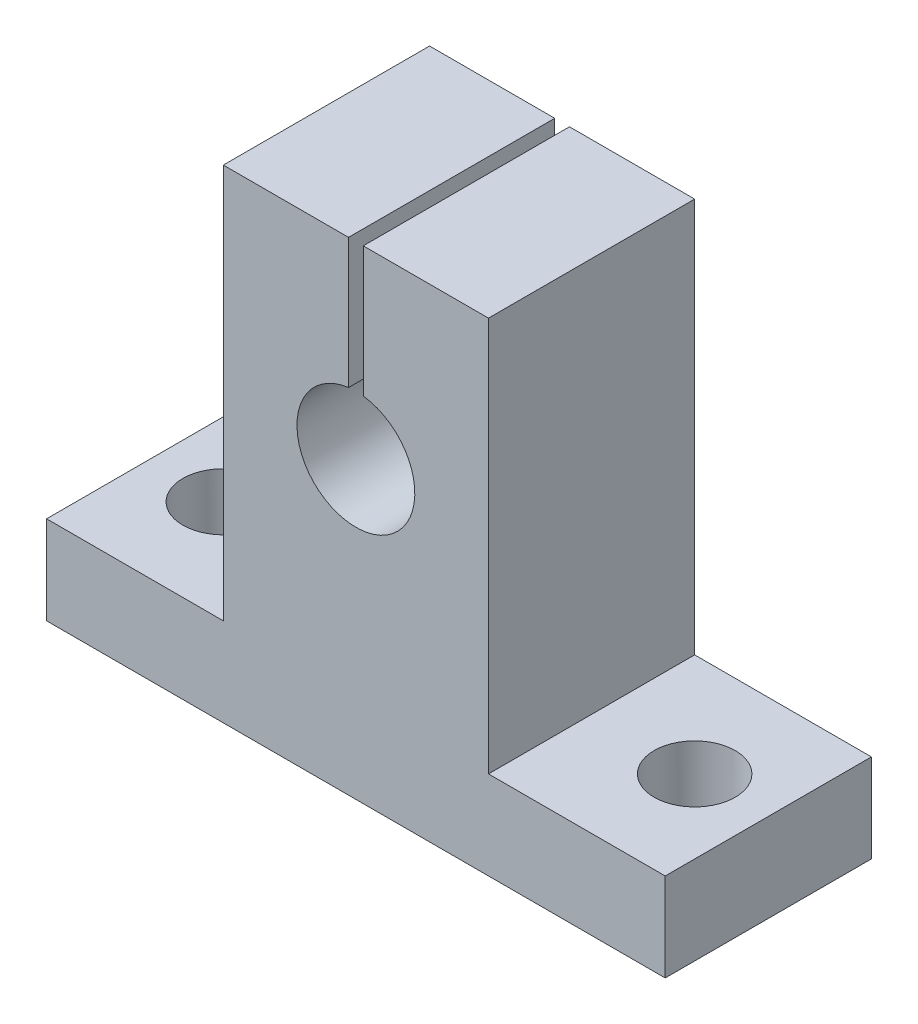
ISO-10303-21;
HEADER;
FILE_DESCRIPTION(('STEP AP214'),'2;1');
FILE_NAME('part.step','',(''),(''),'','','');
FILE_SCHEMA(('AUTOMOTIVE_DESIGN { 1 0 10303 214 1 1 1 1 }'));
ENDSEC;
DATA;
#1=APPLICATION_CONTEXT('core data for automotive mechanical design processes');
#2=APPLICATION_PROTOCOL_DEFINITION('international standard','automotive_design',2000,#1);
#3=PRODUCT_CONTEXT('',#1,'mechanical');
#4=PRODUCT('Part','Part','',(#3));
#5=PRODUCT_RELATED_PRODUCT_CATEGORY('part','',(#4));
#6=PRODUCT_DEFINITION_FORMATION('','',#4);
#7=PRODUCT_DEFINITION_CONTEXT('part definition',#1,'design');
#8=PRODUCT_DEFINITION('design','',#6,#7);
#9=PRODUCT_DEFINITION_SHAPE('','',#8);
#10=(LENGTH_UNIT() NAMED_UNIT(*) SI_UNIT(.MILLI.,.METRE.));
#11=(NAMED_UNIT(*) PLANE_ANGLE_UNIT() SI_UNIT($,.RADIAN.));
#12=(NAMED_UNIT(*) SI_UNIT($,.STERADIAN.) SOLID_ANGLE_UNIT());
#13=UNCERTAINTY_MEASURE_WITH_UNIT(LENGTH_MEASURE(1.E-05),#10,'distance_accuracy_value','');
#14=(GEOMETRIC_REPRESENTATION_CONTEXT(3) GLOBAL_UNCERTAINTY_ASSIGNED_CONTEXT((#13)) GLOBAL_UNIT_ASSIGNED_CONTEXT((#10,
#11,#12)) REPRESENTATION_CONTEXT('',''));
#15=CARTESIAN_POINT('',(0.,0.,0.));
#16=DIRECTION('',(0.,0.,1.));
#17=DIRECTION('',(1.,0.,0.));
#18=AXIS2_PLACEMENT_3D('',#15,#16,#17);
#19=CARTESIAN_POINT('',(9.,12.8,-7.));
#20=DIRECTION('',(0.,1.,0.));
#21=DIRECTION('',(0.,0.,1.));
#22=AXIS2_PLACEMENT_3D('',#19,#20,#21);
#23=PLANE('',#22);
#24=DIRECTION('',(0.,0.,1.));
#25=VECTOR('',#24,1.);
#26=CARTESIAN_POINT('',(-0.5,12.8,-7.));
#27=LINE('',#26,#25);
#28=CARTESIAN_POINT('',(-0.5,12.8,-7.));
#29=VERTEX_POINT('',#28);
#30=CARTESIAN_POINT('',(-0.5,12.8,7.));
#31=VERTEX_POINT('',#30);
#32=EDGE_CURVE('E42',#29,#31,#27,.T.);
#33=ORIENTED_EDGE('',*,*,#32,.F.);
#34=DIRECTION('',(-1.,0.,0.));
#35=VECTOR('',#34,1.);
#36=CARTESIAN_POINT('',(9.,12.8,-7.));
#37=LINE('',#36,#35);
#38=CARTESIAN_POINT('',(-9.,12.8,-7.));
#39=VERTEX_POINT('',#38);
#40=EDGE_CURVE('E161',#29,#39,#37,.T.);
#41=ORIENTED_EDGE('',*,*,#40,.T.);
#42=DIRECTION('',(0.,0.,1.));
#43=VECTOR('',#42,1.);
#44=CARTESIAN_POINT('',(-9.,12.8,-7.));
#45=LINE('',#44,#43);
#46=CARTESIAN_POINT('',(-9.,12.8,7.));
#47=VERTEX_POINT('',#46);
#48=EDGE_CURVE('E188',#39,#47,#45,.T.);
#49=ORIENTED_EDGE('',*,*,#48,.T.);
#50=DIRECTION('',(-1.,0.,0.));
#51=VECTOR('',#50,1.);
#52=CARTESIAN_POINT('',(9.,12.8,7.));
#53=LINE('',#52,#51);
#54=EDGE_CURVE('E136',#31,#47,#53,.T.);
#55=ORIENTED_EDGE('',*,*,#54,.F.);
#56=EDGE_LOOP('',(#33,#41,#49,#55));
#57=FACE_BOUND('',#56,.T.);
#58=ADVANCED_FACE('F17',(#57),#23,.T.);
#59=CARTESIAN_POINT('',(9.,-14.,-7.));
#60=DIRECTION('',(0.,1.,0.));
#61=DIRECTION('',(-1.,0.,0.));
#62=AXIS2_PLACEMENT_3D('',#59,#60,#61);
#63=PLANE('',#62);
#64=CARTESIAN_POINT('',(16.,-14.,0.));
#65=DIRECTION('',(0.,1.,0.));
#66=DIRECTION('',(-1.,0.,0.));
#67=AXIS2_PLACEMENT_3D('',#64,#65,#66);
#68=CIRCLE('',#67,2.75);
#69=CARTESIAN_POINT('',(13.25,-14.,0.));
#70=VERTEX_POINT('',#69);
#71=EDGE_CURVE('E222',#70,#70,#68,.T.);
#72=ORIENTED_EDGE('',*,*,#71,.F.);
#73=EDGE_LOOP('',(#72));
#74=FACE_BOUND('',#73,.T.);
#75=DIRECTION('',(0.,0.,1.));
#76=VECTOR('',#75,1.);
#77=CARTESIAN_POINT('',(9.,-14.,-7.));
#78=LINE('',#77,#76);
#79=CARTESIAN_POINT('',(9.,-14.,-7.));
#80=VERTEX_POINT('',#79);
#81=CARTESIAN_POINT('',(9.,-14.,7.));
#82=VERTEX_POINT('',#81);
#83=EDGE_CURVE('E179',#80,#82,#78,.T.);
#84=ORIENTED_EDGE('',*,*,#83,.T.);
#85=DIRECTION('',(-1.,0.,0.));
#86=VECTOR('',#85,1.);
#87=CARTESIAN_POINT('',(9.,-14.,7.));
#88=LINE('',#87,#86);
#89=CARTESIAN_POINT('',(21.,-14.,7.));
#90=VERTEX_POINT('',#89);
#91=EDGE_CURVE('E125',#90,#82,#88,.T.);
#92=ORIENTED_EDGE('',*,*,#91,.F.);
#93=DIRECTION('',(0.,0.,1.));
#94=VECTOR('',#93,1.);
#95=CARTESIAN_POINT('',(21.,-14.,-7.));
#96=LINE('',#95,#94);
#97=CARTESIAN_POINT('',(21.,-14.,-7.));
#98=VERTEX_POINT('',#97);
#99=EDGE_CURVE('E11',#98,#90,#96,.T.);
#100=ORIENTED_EDGE('',*,*,#99,.F.);
#101=DIRECTION('',(-1.,0.,0.));
#102=VECTOR('',#101,1.);
#103=CARTESIAN_POINT('',(9.,-14.,-7.));
#104=LINE('',#103,#102);
#105=EDGE_CURVE('E155',#98,#80,#104,.T.);
#106=ORIENTED_EDGE('',*,*,#105,.T.);
#107=EDGE_LOOP('',(#84,#92,#100,#106));
#108=FACE_BOUND('',#107,.T.);
#109=ADVANCED_FACE('F19',(#74,#108),#63,.T.);
#110=CARTESIAN_POINT('',(21.,-14.,-7.));
#111=DIRECTION('',(1.,0.,0.));
#112=DIRECTION('',(0.,0.,-1.));
#113=AXIS2_PLACEMENT_3D('',#110,#111,#112);
#114=PLANE('',#113);
#115=ORIENTED_EDGE('',*,*,#99,.T.);
#116=DIRECTION('',(0.,1.,0.));
#117=VECTOR('',#116,1.);
#118=CARTESIAN_POINT('',(21.,-14.,7.));
#119=LINE('',#118,#117);
#120=CARTESIAN_POINT('',(21.,-20.,7.));
#121=VERTEX_POINT('',#120);
#122=EDGE_CURVE('E151',#121,#90,#119,.T.);
#123=ORIENTED_EDGE('',*,*,#122,.F.);
#124=DIRECTION('',(0.,0.,1.));
#125=VECTOR('',#124,1.);
#126=CARTESIAN_POINT('',(21.,-20.,-7.));
#127=LINE('',#126,#125);
#128=CARTESIAN_POINT('',(21.,-20.,-7.));
#129=VERTEX_POINT('',#128);
#130=EDGE_CURVE('E26',#129,#121,#127,.T.);
#131=ORIENTED_EDGE('',*,*,#130,.F.);
#132=DIRECTION('',(0.,1.,0.));
#133=VECTOR('',#132,1.);
#134=CARTESIAN_POINT('',(21.,-14.,-7.));
#135=LINE('',#134,#133);
#136=EDGE_CURVE('E177',#129,#98,#135,.T.);
#137=ORIENTED_EDGE('',*,*,#136,.T.);
#138=EDGE_LOOP('',(#115,#123,#131,#137));
#139=FACE_BOUND('',#138,.T.);
#140=ADVANCED_FACE('F203',(#139),#114,.T.);
#141=CARTESIAN_POINT('',(-21.,-20.,-7.));
#142=DIRECTION('',(0.,-1.,0.));
#143=DIRECTION('',(0.,0.,-1.));
#144=AXIS2_PLACEMENT_3D('',#141,#142,#143);
#145=PLANE('',#144);
#146=CARTESIAN_POINT('',(16.,-20.,0.));
#147=DIRECTION('',(0.,1.,0.));
#148=DIRECTION('',(0.,0.,1.));
#149=AXIS2_PLACEMENT_3D('',#146,#147,#148);
#150=CIRCLE('',#149,2.75);
#151=CARTESIAN_POINT('',(16.,-20.,2.75));
#152=VERTEX_POINT('',#151);
#153=EDGE_CURVE('E225',#152,#152,#150,.T.);
#154=ORIENTED_EDGE('',*,*,#153,.T.);
#155=EDGE_LOOP('',(#154));
#156=FACE_BOUND('',#155,.T.);
#157=CARTESIAN_POINT('',(-16.,-20.,0.));
#158=DIRECTION('',(0.,1.,0.));
#159=DIRECTION('',(0.,0.,1.));
#160=AXIS2_PLACEMENT_3D('',#157,#158,#159);
#161=CIRCLE('',#160,2.75);
#162=CARTESIAN_POINT('',(-16.,-20.,2.75));
#163=VERTEX_POINT('',#162);
#164=EDGE_CURVE('E219',#163,#163,#161,.T.);
#165=ORIENTED_EDGE('',*,*,#164,.T.);
#166=EDGE_LOOP('',(#165));
#167=FACE_BOUND('',#166,.T.);
#168=ORIENTED_EDGE('',*,*,#130,.T.);
#169=DIRECTION('',(1.,0.,0.));
#170=VECTOR('',#169,1.);
#171=CARTESIAN_POINT('',(-21.,-20.,7.));
#172=LINE('',#171,#170);
#173=CARTESIAN_POINT('',(-21.,-20.,7.));
#174=VERTEX_POINT('',#173);
#175=EDGE_CURVE('E148',#174,#121,#172,.T.);
#176=ORIENTED_EDGE('',*,*,#175,.F.);
#177=DIRECTION('',(0.,0.,1.));
#178=VECTOR('',#177,1.);
#179=CARTESIAN_POINT('',(-21.,-20.,-7.));
#180=LINE('',#179,#178);
#181=CARTESIAN_POINT('',(-21.,-20.,-7.));
#182=VERTEX_POINT('',#181);
#183=EDGE_CURVE('E182',#182,#174,#180,.T.);
#184=ORIENTED_EDGE('',*,*,#183,.F.);
#185=DIRECTION('',(1.,0.,0.));
#186=VECTOR('',#185,1.);
#187=CARTESIAN_POINT('',(-21.,-20.,-7.));
#188=LINE('',#187,#186);
#189=EDGE_CURVE('E174',#182,#129,#188,.T.);
#190=ORIENTED_EDGE('',*,*,#189,.T.);
#191=EDGE_LOOP('',(#168,#176,#184,#190));
#192=FACE_BOUND('',#191,.T.);
#193=ADVANCED_FACE('F229',(#156,#167,#192),#145,.T.);
#194=CARTESIAN_POINT('',(-21.,-14.,-7.));
#195=DIRECTION('',(-1.,0.,0.));
#196=DIRECTION('',(0.,0.,1.));
#197=AXIS2_PLACEMENT_3D('',#194,#195,#196);
#198=PLANE('',#197);
#199=ORIENTED_EDGE('',*,*,#183,.T.);
#200=DIRECTION('',(0.,-1.,0.));
#201=VECTOR('',#200,1.);
#202=CARTESIAN_POINT('',(-21.,-14.,7.));
#203=LINE('',#202,#201);
#204=CARTESIAN_POINT('',(-21.,-14.,7.));
#205=VERTEX_POINT('',#204);
#206=EDGE_CURVE('E145',#205,#174,#203,.T.);
#207=ORIENTED_EDGE('',*,*,#206,.F.);
#208=DIRECTION('',(0.,0.,1.));
#209=VECTOR('',#208,1.);
#210=CARTESIAN_POINT('',(-21.,-14.,-7.));
#211=LINE('',#210,#209);
#212=CARTESIAN_POINT('',(-21.,-14.,-7.));
#213=VERTEX_POINT('',#212);
#214=EDGE_CURVE('E184',#213,#205,#211,.T.);
#215=ORIENTED_EDGE('',*,*,#214,.F.);
#216=DIRECTION('',(0.,-1.,0.));
#217=VECTOR('',#216,1.);
#218=CARTESIAN_POINT('',(-21.,-14.,-7.));
#219=LINE('',#218,#217);
#220=EDGE_CURVE('E171',#213,#182,#219,.T.);
#221=ORIENTED_EDGE('',*,*,#220,.T.);
#222=EDGE_LOOP('',(#199,#207,#215,#221));
#223=FACE_BOUND('',#222,.T.);
#224=ADVANCED_FACE('F266',(#223),#198,.T.);
#225=CARTESIAN_POINT('',(-9.,-14.,-7.));
#226=DIRECTION('',(0.,1.,0.));
#227=DIRECTION('',(-1.,0.,0.));
#228=AXIS2_PLACEMENT_3D('',#225,#226,#227);
#229=PLANE('',#228);
#230=CARTESIAN_POINT('',(-16.,-14.,0.));
#231=DIRECTION('',(0.,1.,0.));
#232=DIRECTION('',(-1.,0.,0.));
#233=AXIS2_PLACEMENT_3D('',#230,#231,#232);
#234=CIRCLE('',#233,2.75);
#235=CARTESIAN_POINT('',(-18.75,-14.,0.));
#236=VERTEX_POINT('',#235);
#237=EDGE_CURVE('E21',#236,#236,#234,.T.);
#238=ORIENTED_EDGE('',*,*,#237,.F.);
#239=EDGE_LOOP('',(#238));
#240=FACE_BOUND('',#239,.T.);
#241=ORIENTED_EDGE('',*,*,#214,.T.);
#242=DIRECTION('',(-1.,0.,0.));
#243=VECTOR('',#242,1.);
#244=CARTESIAN_POINT('',(-9.,-14.,7.));
#245=LINE('',#244,#243);
#246=CARTESIAN_POINT('',(-9.,-14.,7.));
#247=VERTEX_POINT('',#246);
#248=EDGE_CURVE('E142',#247,#205,#245,.T.);
#249=ORIENTED_EDGE('',*,*,#248,.F.);
#250=DIRECTION('',(0.,0.,1.));
#251=VECTOR('',#250,1.);
#252=CARTESIAN_POINT('',(-9.,-14.,-7.));
#253=LINE('',#252,#251);
#254=CARTESIAN_POINT('',(-9.,-14.,-7.));
#255=VERTEX_POINT('',#254);
#256=EDGE_CURVE('E186',#255,#247,#253,.T.);
#257=ORIENTED_EDGE('',*,*,#256,.F.);
#258=DIRECTION('',(-1.,0.,0.));
#259=VECTOR('',#258,1.);
#260=CARTESIAN_POINT('',(-9.,-14.,-7.));
#261=LINE('',#260,#259);
#262=EDGE_CURVE('E168',#255,#213,#261,.T.);
#263=ORIENTED_EDGE('',*,*,#262,.T.);
#264=EDGE_LOOP('',(#241,#249,#257,#263));
#265=FACE_BOUND('',#264,.T.);
#266=ADVANCED_FACE('F260',(#240,#265),#229,.T.);
#267=CARTESIAN_POINT('',(-9.,12.8,-7.));
#268=DIRECTION('',(-1.,0.,0.));
#269=DIRECTION('',(0.,-1.,0.));
#270=AXIS2_PLACEMENT_3D('',#267,#268,#269);
#271=PLANE('',#270);
#272=ORIENTED_EDGE('',*,*,#256,.T.);
#273=DIRECTION('',(0.,-1.,0.));
#274=VECTOR('',#273,1.);
#275=CARTESIAN_POINT('',(-9.,12.8,7.));
#276=LINE('',#275,#274);
#277=EDGE_CURVE('E139',#47,#247,#276,.T.);
#278=ORIENTED_EDGE('',*,*,#277,.F.);
#279=ORIENTED_EDGE('',*,*,#48,.F.);
#280=DIRECTION('',(0.,-1.,0.));
#281=VECTOR('',#280,1.);
#282=CARTESIAN_POINT('',(-9.,12.8,-7.));
#283=LINE('',#282,#281);
#284=EDGE_CURVE('E165',#39,#255,#283,.T.);
#285=ORIENTED_EDGE('',*,*,#284,.T.);
#286=EDGE_LOOP('',(#272,#278,#279,#285));
#287=FACE_BOUND('',#286,.T.);
#288=ADVANCED_FACE('F254',(#287),#271,.T.);
#289=DIRECTION('',(0.,0.,1.));
#290=VECTOR('',#289,1.);
#291=CARTESIAN_POINT('',(0.5,12.8,-7.));
#292=LINE('',#291,#290);
#293=CARTESIAN_POINT('',(0.5,12.8,-7.));
#294=VERTEX_POINT('',#293);
#295=CARTESIAN_POINT('',(0.5,12.8,7.));
#296=VERTEX_POINT('',#295);
#297=EDGE_CURVE('E130',#294,#296,#292,.T.);
#298=ORIENTED_EDGE('',*,*,#297,.T.);
#299=CARTESIAN_POINT('',(9.,12.8,7.));
#300=VERTEX_POINT('',#299);
#301=EDGE_CURVE('E137',#300,#296,#53,.T.);
#302=ORIENTED_EDGE('',*,*,#301,.F.);
#303=DIRECTION('',(0.,0.,1.));
#304=VECTOR('',#303,1.);
#305=CARTESIAN_POINT('',(9.,12.8,-7.));
#306=LINE('',#305,#304);
#307=CARTESIAN_POINT('',(9.,12.8,-7.));
#308=VERTEX_POINT('',#307);
#309=EDGE_CURVE('E191',#308,#300,#306,.T.);
#310=ORIENTED_EDGE('',*,*,#309,.F.);
#311=EDGE_CURVE('E162',#308,#294,#37,.T.);
#312=ORIENTED_EDGE('',*,*,#311,.T.);
#313=EDGE_LOOP('',(#298,#302,#310,#312));
#314=FACE_BOUND('',#313,.T.);
#315=ADVANCED_FACE('F212',(#314),#23,.T.);
#316=CARTESIAN_POINT('',(9.,12.8,-7.));
#317=DIRECTION('',(1.,0.,0.));
#318=DIRECTION('',(0.,1.,0.));
#319=AXIS2_PLACEMENT_3D('',#316,#317,#318);
#320=PLANE('',#319);
#321=ORIENTED_EDGE('',*,*,#309,.T.);
#322=DIRECTION('',(0.,1.,0.));
#323=VECTOR('',#322,1.);
#324=CARTESIAN_POINT('',(9.,12.8,7.));
#325=LINE('',#324,#323);
#326=EDGE_CURVE('E128',#82,#300,#325,.T.);
#327=ORIENTED_EDGE('',*,*,#326,.F.);
#328=ORIENTED_EDGE('',*,*,#83,.F.);
#329=DIRECTION('',(0.,1.,0.));
#330=VECTOR('',#329,1.);
#331=CARTESIAN_POINT('',(9.,12.8,-7.));
#332=LINE('',#331,#330);
#333=EDGE_CURVE('E158',#80,#308,#332,.T.);
#334=ORIENTED_EDGE('',*,*,#333,.T.);
#335=EDGE_LOOP('',(#321,#327,#328,#334));
#336=FACE_BOUND('',#335,.T.);
#337=ADVANCED_FACE('F198',(#336),#320,.T.);
#338=CARTESIAN_POINT('',(0.,0.,-7.));
#339=DIRECTION('',(0.,0.,-1.));
#340=DIRECTION('',(-1.,0.,0.));
#341=AXIS2_PLACEMENT_3D('',#338,#339,#340);
#342=PLANE('',#341);
#343=DIRECTION('',(0.,-1.,0.));
#344=VECTOR('',#343,1.);
#345=CARTESIAN_POINT('',(-0.5,12.8,-7.));
#346=LINE('',#345,#344);
#347=CARTESIAN_POINT('',(-0.5,3.96862696659689,-7.));
#348=VERTEX_POINT('',#347);
#349=EDGE_CURVE('E216',#29,#348,#346,.T.);
#350=ORIENTED_EDGE('',*,*,#349,.T.);
#351=CARTESIAN_POINT('',(0.,0.,-7.));
#352=DIRECTION('',(0.,0.,1.));
#353=DIRECTION('',(1.,0.,0.));
#354=AXIS2_PLACEMENT_3D('',#351,#352,#353);
#355=CIRCLE('',#354,4.);
#356=CARTESIAN_POINT('',(0.5,3.96862696659689,-7.));
#357=VERTEX_POINT('',#356);
#358=EDGE_CURVE('E120',#348,#357,#355,.T.);
#359=ORIENTED_EDGE('',*,*,#358,.T.);
#360=DIRECTION('',(0.,1.,0.));
#361=VECTOR('',#360,1.);
#362=CARTESIAN_POINT('',(0.5,12.8,-7.));
#363=LINE('',#362,#361);
#364=EDGE_CURVE('E121',#357,#294,#363,.T.);
#365=ORIENTED_EDGE('',*,*,#364,.T.);
#366=ORIENTED_EDGE('',*,*,#311,.F.);
#367=ORIENTED_EDGE('',*,*,#333,.F.);
#368=ORIENTED_EDGE('',*,*,#105,.F.);
#369=ORIENTED_EDGE('',*,*,#136,.F.);
#370=ORIENTED_EDGE('',*,*,#189,.F.);
#371=ORIENTED_EDGE('',*,*,#220,.F.);
#372=ORIENTED_EDGE('',*,*,#262,.F.);
#373=ORIENTED_EDGE('',*,*,#284,.F.);
#374=ORIENTED_EDGE('',*,*,#40,.F.);
#375=EDGE_LOOP('',(#350,#359,#365,#366,#367,#368,#369,#370,#371,#372,#373,#374));
#376=FACE_BOUND('',#375,.T.);
#377=ADVANCED_FACE('F206',(#376),#342,.T.);
#378=CARTESIAN_POINT('',(0.,0.,-7.));
#379=DIRECTION('',(0.,0.,1.));
#380=DIRECTION('',(1.,0.,0.));
#381=AXIS2_PLACEMENT_3D('',#378,#379,#380);
#382=CYLINDRICAL_SURFACE('',#381,4.);
#383=CARTESIAN_POINT('',(0.,0.,7.));
#384=DIRECTION('',(0.,0.,1.));
#385=DIRECTION('',(1.,0.,0.));
#386=AXIS2_PLACEMENT_3D('',#383,#384,#385);
#387=CIRCLE('',#386,4.);
#388=CARTESIAN_POINT('',(-0.5,3.96862696659689,7.));
#389=VERTEX_POINT('',#388);
#390=CARTESIAN_POINT('',(0.5,3.96862696659689,7.));
#391=VERTEX_POINT('',#390);
#392=EDGE_CURVE('E118',#389,#391,#387,.T.);
#393=ORIENTED_EDGE('',*,*,#392,.T.);
#394=DIRECTION('',(0.,0.,1.));
#395=VECTOR('',#394,1.);
#396=CARTESIAN_POINT('',(0.5,3.96862696659689,-7.));
#397=LINE('',#396,#395);
#398=EDGE_CURVE('E34',#357,#391,#397,.T.);
#399=ORIENTED_EDGE('',*,*,#398,.F.);
#400=ORIENTED_EDGE('',*,*,#358,.F.);
#401=DIRECTION('',(0.,0.,1.));
#402=VECTOR('',#401,1.);
#403=CARTESIAN_POINT('',(-0.5,3.96862696659689,-7.));
#404=LINE('',#403,#402);
#405=EDGE_CURVE('E107',#348,#389,#404,.T.);
#406=ORIENTED_EDGE('',*,*,#405,.T.);
#407=EDGE_LOOP('',(#393,#399,#400,#406));
#408=FACE_BOUND('',#407,.T.);
#409=ADVANCED_FACE('F117',(#408),#382,.F.);
#410=CARTESIAN_POINT('',(0.,0.,7.));
#411=DIRECTION('',(0.,0.,-1.));
#412=DIRECTION('',(-1.,0.,0.));
#413=AXIS2_PLACEMENT_3D('',#410,#411,#412);
#414=PLANE('',#413);
#415=ORIENTED_EDGE('',*,*,#392,.F.);
#416=DIRECTION('',(0.,-1.,0.));
#417=VECTOR('',#416,1.);
#418=CARTESIAN_POINT('',(-0.5,12.8,7.));
#419=LINE('',#418,#417);
#420=EDGE_CURVE('E104',#31,#389,#419,.T.);
#421=ORIENTED_EDGE('',*,*,#420,.F.);
#422=ORIENTED_EDGE('',*,*,#54,.T.);
#423=ORIENTED_EDGE('',*,*,#277,.T.);
#424=ORIENTED_EDGE('',*,*,#248,.T.);
#425=ORIENTED_EDGE('',*,*,#206,.T.);
#426=ORIENTED_EDGE('',*,*,#175,.T.);
#427=ORIENTED_EDGE('',*,*,#122,.T.);
#428=ORIENTED_EDGE('',*,*,#91,.T.);
#429=ORIENTED_EDGE('',*,*,#326,.T.);
#430=ORIENTED_EDGE('',*,*,#301,.T.);
#431=DIRECTION('',(0.,1.,0.));
#432=VECTOR('',#431,1.);
#433=CARTESIAN_POINT('',(0.5,12.8,7.));
#434=LINE('',#433,#432);
#435=EDGE_CURVE('E112',#391,#296,#434,.T.);
#436=ORIENTED_EDGE('',*,*,#435,.F.);
#437=EDGE_LOOP('',(#415,#421,#422,#423,#424,#425,#426,#427,#428,#429,#430,#436));
#438=FACE_BOUND('',#437,.T.);
#439=ADVANCED_FACE('F123',(#438),#414,.F.);
#440=CARTESIAN_POINT('',(0.5,12.8,-7.));
#441=DIRECTION('',(1.,0.,0.));
#442=DIRECTION('',(0.,1.,0.));
#443=AXIS2_PLACEMENT_3D('',#440,#441,#442);
#444=PLANE('',#443);
#445=ORIENTED_EDGE('',*,*,#297,.F.);
#446=ORIENTED_EDGE('',*,*,#364,.F.);
#447=ORIENTED_EDGE('',*,*,#398,.T.);
#448=ORIENTED_EDGE('',*,*,#435,.T.);
#449=EDGE_LOOP('',(#445,#446,#447,#448));
#450=FACE_BOUND('',#449,.T.);
#451=ADVANCED_FACE('F283',(#450),#444,.F.);
#452=CARTESIAN_POINT('',(-0.5,12.8,-7.));
#453=DIRECTION('',(-1.,0.,0.));
#454=DIRECTION('',(0.,-1.,0.));
#455=AXIS2_PLACEMENT_3D('',#452,#453,#454);
#456=PLANE('',#455);
#457=ORIENTED_EDGE('',*,*,#405,.F.);
#458=ORIENTED_EDGE('',*,*,#349,.F.);
#459=ORIENTED_EDGE('',*,*,#32,.T.);
#460=ORIENTED_EDGE('',*,*,#420,.T.);
#461=EDGE_LOOP('',(#457,#458,#459,#460));
#462=FACE_BOUND('',#461,.T.);
#463=ADVANCED_FACE('F106',(#462),#456,.F.);
#464=CARTESIAN_POINT('',(-16.,-20.,0.));
#465=DIRECTION('',(0.,1.,0.));
#466=DIRECTION('',(0.,0.,1.));
#467=AXIS2_PLACEMENT_3D('',#464,#465,#466);
#468=CYLINDRICAL_SURFACE('',#467,2.75);
#469=ORIENTED_EDGE('',*,*,#237,.T.);
#470=EDGE_LOOP('',(#469));
#471=FACE_BOUND('',#470,.T.);
#472=ORIENTED_EDGE('',*,*,#164,.F.);
#473=EDGE_LOOP('',(#472));
#474=FACE_BOUND('',#473,.T.);
#475=ADVANCED_FACE('F234',(#471,#474),#468,.F.);
#476=CARTESIAN_POINT('',(16.,-20.,0.));
#477=DIRECTION('',(0.,1.,0.));
#478=DIRECTION('',(0.,0.,1.));
#479=AXIS2_PLACEMENT_3D('',#476,#477,#478);
#480=CYLINDRICAL_SURFACE('',#479,2.75);
#481=ORIENTED_EDGE('',*,*,#71,.T.);
#482=EDGE_LOOP('',(#481));
#483=FACE_BOUND('',#482,.T.);
#484=ORIENTED_EDGE('',*,*,#153,.F.);
#485=EDGE_LOOP('',(#484));
#486=FACE_BOUND('',#485,.T.);
#487=ADVANCED_FACE('F232',(#483,#486),#480,.F.);
#488=CLOSED_SHELL('',(#58,#109,#140,#193,#224,#266,#288,#315,#337,#377,#409,#439,#451,#463,#475,#487));
#489=MANIFOLD_SOLID_BREP('B1',#488);
#490=ADVANCED_BREP_SHAPE_REPRESENTATION('',(#18,#489),#14);
#491=SHAPE_DEFINITION_REPRESENTATION(#9,#490);
ENDSEC;
END-ISO-10303-21;
